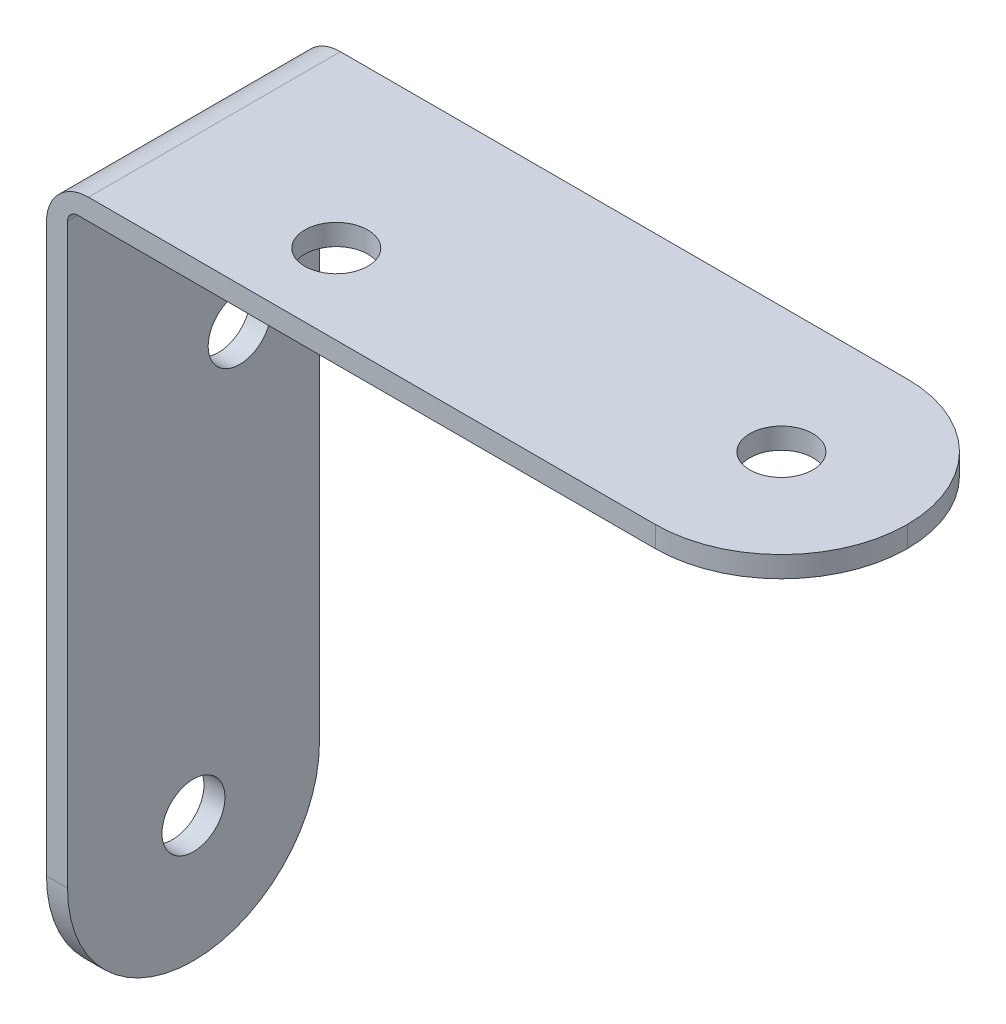
ISO-10303-21;
HEADER;
FILE_DESCRIPTION(('STEP AP214'),'2;1');
FILE_NAME('part.step','',(''),(''),'','','');
FILE_SCHEMA(('AUTOMOTIVE_DESIGN { 1 0 10303 214 1 1 1 1 }'));
ENDSEC;
DATA;
#1=APPLICATION_CONTEXT('core data for automotive mechanical design processes');
#2=APPLICATION_PROTOCOL_DEFINITION('international standard','automotive_design',2000,#1);
#3=PRODUCT_CONTEXT('',#1,'mechanical');
#4=PRODUCT('Part','Part','',(#3));
#5=PRODUCT_RELATED_PRODUCT_CATEGORY('part','',(#4));
#6=PRODUCT_DEFINITION_FORMATION('','',#4);
#7=PRODUCT_DEFINITION_CONTEXT('part definition',#1,'design');
#8=PRODUCT_DEFINITION('design','',#6,#7);
#9=PRODUCT_DEFINITION_SHAPE('','',#8);
#10=(LENGTH_UNIT() NAMED_UNIT(*) SI_UNIT(.MILLI.,.METRE.));
#11=(NAMED_UNIT(*) PLANE_ANGLE_UNIT() SI_UNIT($,.RADIAN.));
#12=(NAMED_UNIT(*) SI_UNIT($,.STERADIAN.) SOLID_ANGLE_UNIT());
#13=UNCERTAINTY_MEASURE_WITH_UNIT(LENGTH_MEASURE(1.E-05),#10,'distance_accuracy_value','');
#14=(GEOMETRIC_REPRESENTATION_CONTEXT(3) GLOBAL_UNCERTAINTY_ASSIGNED_CONTEXT((#13)) GLOBAL_UNIT_ASSIGNED_CONTEXT((#10,
#11,#12)) REPRESENTATION_CONTEXT('',''));
#15=CARTESIAN_POINT('',(0.,0.,0.));
#16=DIRECTION('',(0.,0.,1.));
#17=DIRECTION('',(1.,0.,0.));
#18=AXIS2_PLACEMENT_3D('',#15,#16,#17);
#19=CARTESIAN_POINT('',(0.,-35.,12.));
#20=DIRECTION('',(1.,0.,0.));
#21=DIRECTION('',(0.,0.,-1.));
#22=AXIS2_PLACEMENT_3D('',#19,#20,#21);
#23=PLANE('',#22);
#24=CARTESIAN_POINT('',(0.,-29.,6.));
#25=DIRECTION('',(-1.,0.,0.));
#26=DIRECTION('',(0.,0.,1.));
#27=AXIS2_PLACEMENT_3D('',#24,#25,#26);
#28=CIRCLE('',#27,1.5);
#29=CARTESIAN_POINT('',(0.,-29.,7.5));
#30=VERTEX_POINT('',#29);
#31=EDGE_CURVE('E210',#30,#30,#28,.T.);
#32=ORIENTED_EDGE('',*,*,#31,.F.);
#33=EDGE_LOOP('',(#32));
#34=FACE_BOUND('',#33,.T.);
#35=CARTESIAN_POINT('',(0.,-10.,3.8));
#36=DIRECTION('',(-1.,0.,0.));
#37=DIRECTION('',(0.,0.,1.));
#38=AXIS2_PLACEMENT_3D('',#35,#36,#37);
#39=CIRCLE('',#38,1.5);
#40=CARTESIAN_POINT('',(0.,-10.,5.3));
#41=VERTEX_POINT('',#40);
#42=EDGE_CURVE('E217',#41,#41,#39,.T.);
#43=ORIENTED_EDGE('',*,*,#42,.F.);
#44=EDGE_LOOP('',(#43));
#45=FACE_BOUND('',#44,.T.);
#46=DIRECTION('',(0.,-1.,0.));
#47=VECTOR('',#46,1.);
#48=CARTESIAN_POINT('',(0.,-35.,12.));
#49=LINE('',#48,#47);
#50=CARTESIAN_POINT('',(0.,-2.,12.));
#51=VERTEX_POINT('',#50);
#52=CARTESIAN_POINT('',(0.,-29.,12.));
#53=VERTEX_POINT('',#52);
#54=EDGE_CURVE('E119',#51,#53,#49,.T.);
#55=ORIENTED_EDGE('',*,*,#54,.F.);
#56=DIRECTION('',(0.,0.,-1.));
#57=VECTOR('',#56,1.);
#58=CARTESIAN_POINT('',(0.,-2.,12.));
#59=LINE('',#58,#57);
#60=CARTESIAN_POINT('',(0.,-2.,0.));
#61=VERTEX_POINT('',#60);
#62=EDGE_CURVE('E181',#51,#61,#59,.T.);
#63=ORIENTED_EDGE('',*,*,#62,.T.);
#64=DIRECTION('',(0.,-1.,0.));
#65=VECTOR('',#64,1.);
#66=CARTESIAN_POINT('',(0.,-35.,0.));
#67=LINE('',#66,#65);
#68=CARTESIAN_POINT('',(0.,-29.,0.));
#69=VERTEX_POINT('',#68);
#70=EDGE_CURVE('E185',#61,#69,#67,.T.);
#71=ORIENTED_EDGE('',*,*,#70,.T.);
#72=CARTESIAN_POINT('',(0.,-29.,6.));
#73=DIRECTION('',(1.,0.,0.));
#74=DIRECTION('',(0.,0.,-1.));
#75=AXIS2_PLACEMENT_3D('',#72,#73,#74);
#76=CIRCLE('',#75,6.);
#77=CARTESIAN_POINT('',(0.,-35.,6.));
#78=VERTEX_POINT('',#77);
#79=EDGE_CURVE('E137',#69,#78,#76,.F.);
#80=ORIENTED_EDGE('',*,*,#79,.T.);
#81=CARTESIAN_POINT('',(0.,-29.,6.));
#82=DIRECTION('',(1.,0.,0.));
#83=DIRECTION('',(0.,0.,-1.));
#84=AXIS2_PLACEMENT_3D('',#81,#82,#83);
#85=CIRCLE('',#84,6.);
#86=EDGE_CURVE('E135',#78,#53,#85,.F.);
#87=ORIENTED_EDGE('',*,*,#86,.T.);
#88=EDGE_LOOP('',(#55,#63,#71,#80,#87));
#89=FACE_BOUND('',#88,.T.);
#90=ADVANCED_FACE('F39',(#34,#45,#89),#23,.F.);
#91=CARTESIAN_POINT('',(0.999999999999997,-1.,12.));
#92=DIRECTION('',(-1.,0.,0.));
#93=DIRECTION('',(0.,-1.,0.));
#94=AXIS2_PLACEMENT_3D('',#91,#92,#93);
#95=PLANE('',#94);
#96=CARTESIAN_POINT('',(1.00000000000001,-29.,6.));
#97=DIRECTION('',(-1.,0.,0.));
#98=DIRECTION('',(0.,-1.,0.));
#99=AXIS2_PLACEMENT_3D('',#96,#97,#98);
#100=CIRCLE('',#99,1.5);
#101=CARTESIAN_POINT('',(1.00000000000001,-30.5,6.));
#102=VERTEX_POINT('',#101);
#103=EDGE_CURVE('E43',#102,#102,#100,.T.);
#104=ORIENTED_EDGE('',*,*,#103,.T.);
#105=EDGE_LOOP('',(#104));
#106=FACE_BOUND('',#105,.T.);
#107=CARTESIAN_POINT('',(1.,-10.,3.8));
#108=DIRECTION('',(-1.,0.,0.));
#109=DIRECTION('',(0.,-1.,0.));
#110=AXIS2_PLACEMENT_3D('',#107,#108,#109);
#111=CIRCLE('',#110,1.5);
#112=CARTESIAN_POINT('',(1.,-11.5,3.8));
#113=VERTEX_POINT('',#112);
#114=EDGE_CURVE('E207',#113,#113,#111,.T.);
#115=ORIENTED_EDGE('',*,*,#114,.T.);
#116=EDGE_LOOP('',(#115));
#117=FACE_BOUND('',#116,.T.);
#118=DIRECTION('',(0.,1.,0.));
#119=VECTOR('',#118,1.);
#120=CARTESIAN_POINT('',(0.999999999999997,-1.,0.));
#121=LINE('',#120,#119);
#122=CARTESIAN_POINT('',(1.,-29.,0.));
#123=VERTEX_POINT('',#122);
#124=CARTESIAN_POINT('',(0.999999999999997,-1.5,0.));
#125=VERTEX_POINT('',#124);
#126=EDGE_CURVE('E237',#123,#125,#121,.T.);
#127=ORIENTED_EDGE('',*,*,#126,.T.);
#128=DIRECTION('',(0.,0.,-1.));
#129=VECTOR('',#128,1.);
#130=CARTESIAN_POINT('',(0.999999999999997,-1.5,12.));
#131=LINE('',#130,#129);
#132=CARTESIAN_POINT('',(0.999999999999997,-1.5,12.));
#133=VERTEX_POINT('',#132);
#134=EDGE_CURVE('E63',#125,#133,#131,.F.);
#135=ORIENTED_EDGE('',*,*,#134,.T.);
#136=DIRECTION('',(0.,1.,0.));
#137=VECTOR('',#136,1.);
#138=CARTESIAN_POINT('',(0.999999999999997,-1.,12.));
#139=LINE('',#138,#137);
#140=CARTESIAN_POINT('',(1.,-29.,12.));
#141=VERTEX_POINT('',#140);
#142=EDGE_CURVE('E131',#141,#133,#139,.T.);
#143=ORIENTED_EDGE('',*,*,#142,.F.);
#144=CARTESIAN_POINT('',(1.,-29.,6.));
#145=DIRECTION('',(-1.,0.,0.));
#146=DIRECTION('',(0.,-1.,0.));
#147=AXIS2_PLACEMENT_3D('',#144,#145,#146);
#148=CIRCLE('',#147,6.);
#149=CARTESIAN_POINT('',(1.,-35.,6.));
#150=VERTEX_POINT('',#149);
#151=EDGE_CURVE('E145',#141,#150,#148,.F.);
#152=ORIENTED_EDGE('',*,*,#151,.T.);
#153=CARTESIAN_POINT('',(1.,-29.,6.));
#154=DIRECTION('',(-1.,0.,0.));
#155=DIRECTION('',(0.,-1.,0.));
#156=AXIS2_PLACEMENT_3D('',#153,#154,#155);
#157=CIRCLE('',#156,6.);
#158=EDGE_CURVE('E147',#150,#123,#157,.F.);
#159=ORIENTED_EDGE('',*,*,#158,.T.);
#160=EDGE_LOOP('',(#127,#135,#143,#152,#159));
#161=FACE_BOUND('',#160,.T.);
#162=ADVANCED_FACE('F259',(#106,#117,#161),#95,.F.);
#163=CARTESIAN_POINT('',(35.,-1.,12.));
#164=DIRECTION('',(0.,1.,0.));
#165=DIRECTION('',(0.,0.,1.));
#166=AXIS2_PLACEMENT_3D('',#163,#164,#165);
#167=PLANE('',#166);
#168=CARTESIAN_POINT('',(29.,-1.,6.));
#169=DIRECTION('',(0.,1.,0.));
#170=DIRECTION('',(0.,0.,1.));
#171=AXIS2_PLACEMENT_3D('',#168,#169,#170);
#172=CIRCLE('',#171,1.5);
#173=CARTESIAN_POINT('',(29.,-1.,7.5));
#174=VERTEX_POINT('',#173);
#175=EDGE_CURVE('E223',#174,#174,#172,.T.);
#176=ORIENTED_EDGE('',*,*,#175,.T.);
#177=EDGE_LOOP('',(#176));
#178=FACE_BOUND('',#177,.T.);
#179=CARTESIAN_POINT('',(10.,-1.,8.2));
#180=DIRECTION('',(0.,1.,0.));
#181=DIRECTION('',(0.,0.,1.));
#182=AXIS2_PLACEMENT_3D('',#179,#180,#181);
#183=CIRCLE('',#182,1.5);
#184=CARTESIAN_POINT('',(10.,-1.,9.7));
#185=VERTEX_POINT('',#184);
#186=EDGE_CURVE('E316',#185,#185,#183,.T.);
#187=ORIENTED_EDGE('',*,*,#186,.T.);
#188=EDGE_LOOP('',(#187));
#189=FACE_BOUND('',#188,.T.);
#190=DIRECTION('',(1.,0.,0.));
#191=VECTOR('',#190,1.);
#192=CARTESIAN_POINT('',(35.,-1.,12.));
#193=LINE('',#192,#191);
#194=CARTESIAN_POINT('',(1.49999999999999,-1.,12.));
#195=VERTEX_POINT('',#194);
#196=CARTESIAN_POINT('',(29.,-1.,12.));
#197=VERTEX_POINT('',#196);
#198=EDGE_CURVE('E230',#195,#197,#193,.T.);
#199=ORIENTED_EDGE('',*,*,#198,.F.);
#200=DIRECTION('',(0.,0.,-1.));
#201=VECTOR('',#200,1.);
#202=CARTESIAN_POINT('',(1.49999999999999,-1.,0.));
#203=LINE('',#202,#201);
#204=CARTESIAN_POINT('',(1.49999999999999,-1.,0.));
#205=VERTEX_POINT('',#204);
#206=EDGE_CURVE('E200',#195,#205,#203,.T.);
#207=ORIENTED_EDGE('',*,*,#206,.T.);
#208=DIRECTION('',(1.,0.,0.));
#209=VECTOR('',#208,1.);
#210=CARTESIAN_POINT('',(35.,-1.,0.));
#211=LINE('',#210,#209);
#212=CARTESIAN_POINT('',(29.,-1.,0.));
#213=VERTEX_POINT('',#212);
#214=EDGE_CURVE('E240',#205,#213,#211,.T.);
#215=ORIENTED_EDGE('',*,*,#214,.T.);
#216=CARTESIAN_POINT('',(29.,-1.,6.));
#217=DIRECTION('',(0.,1.,0.));
#218=DIRECTION('',(0.,0.,1.));
#219=AXIS2_PLACEMENT_3D('',#216,#217,#218);
#220=CIRCLE('',#219,6.);
#221=CARTESIAN_POINT('',(35.,-1.,6.));
#222=VERTEX_POINT('',#221);
#223=EDGE_CURVE('E178',#213,#222,#220,.F.);
#224=ORIENTED_EDGE('',*,*,#223,.T.);
#225=CARTESIAN_POINT('',(29.,-1.,6.));
#226=DIRECTION('',(0.,1.,0.));
#227=DIRECTION('',(0.,0.,1.));
#228=AXIS2_PLACEMENT_3D('',#225,#226,#227);
#229=CIRCLE('',#228,6.);
#230=EDGE_CURVE('E174',#222,#197,#229,.F.);
#231=ORIENTED_EDGE('',*,*,#230,.T.);
#232=EDGE_LOOP('',(#199,#207,#215,#224,#231));
#233=FACE_BOUND('',#232,.T.);
#234=ADVANCED_FACE('F265',(#178,#189,#233),#167,.F.);
#235=CARTESIAN_POINT('',(0.,0.,12.));
#236=DIRECTION('',(0.,-1.,0.));
#237=DIRECTION('',(0.,0.,-1.));
#238=AXIS2_PLACEMENT_3D('',#235,#236,#237);
#239=PLANE('',#238);
#240=CARTESIAN_POINT('',(29.,0.,6.));
#241=DIRECTION('',(0.,1.,0.));
#242=DIRECTION('',(0.,0.,1.));
#243=AXIS2_PLACEMENT_3D('',#240,#241,#242);
#244=CIRCLE('',#243,1.5);
#245=CARTESIAN_POINT('',(29.,0.,7.5));
#246=VERTEX_POINT('',#245);
#247=EDGE_CURVE('E319',#246,#246,#244,.T.);
#248=ORIENTED_EDGE('',*,*,#247,.F.);
#249=EDGE_LOOP('',(#248));
#250=FACE_BOUND('',#249,.T.);
#251=CARTESIAN_POINT('',(10.,0.,8.2));
#252=DIRECTION('',(0.,1.,0.));
#253=DIRECTION('',(0.,0.,1.));
#254=AXIS2_PLACEMENT_3D('',#251,#252,#253);
#255=CIRCLE('',#254,1.5);
#256=CARTESIAN_POINT('',(10.,0.,9.7));
#257=VERTEX_POINT('',#256);
#258=EDGE_CURVE('E323',#257,#257,#255,.T.);
#259=ORIENTED_EDGE('',*,*,#258,.F.);
#260=EDGE_LOOP('',(#259));
#261=FACE_BOUND('',#260,.T.);
#262=DIRECTION('',(-1.,0.,0.));
#263=VECTOR('',#262,1.);
#264=CARTESIAN_POINT('',(0.,0.,0.));
#265=LINE('',#264,#263);
#266=CARTESIAN_POINT('',(29.,0.,0.));
#267=VERTEX_POINT('',#266);
#268=CARTESIAN_POINT('',(2.,0.,0.));
#269=VERTEX_POINT('',#268);
#270=EDGE_CURVE('E132',#267,#269,#265,.T.);
#271=ORIENTED_EDGE('',*,*,#270,.T.);
#272=DIRECTION('',(0.,0.,-1.));
#273=VECTOR('',#272,1.);
#274=CARTESIAN_POINT('',(2.,0.,12.));
#275=LINE('',#274,#273);
#276=CARTESIAN_POINT('',(2.,0.,12.));
#277=VERTEX_POINT('',#276);
#278=EDGE_CURVE('E195',#269,#277,#275,.F.);
#279=ORIENTED_EDGE('',*,*,#278,.T.);
#280=DIRECTION('',(-1.,0.,0.));
#281=VECTOR('',#280,1.);
#282=CARTESIAN_POINT('',(0.,0.,12.));
#283=LINE('',#282,#281);
#284=CARTESIAN_POINT('',(29.,0.,12.));
#285=VERTEX_POINT('',#284);
#286=EDGE_CURVE('E153',#285,#277,#283,.T.);
#287=ORIENTED_EDGE('',*,*,#286,.F.);
#288=CARTESIAN_POINT('',(29.,0.,6.));
#289=DIRECTION('',(0.,-1.,0.));
#290=DIRECTION('',(0.,0.,-1.));
#291=AXIS2_PLACEMENT_3D('',#288,#289,#290);
#292=CIRCLE('',#291,6.);
#293=CARTESIAN_POINT('',(35.,0.,6.));
#294=VERTEX_POINT('',#293);
#295=EDGE_CURVE('E168',#285,#294,#292,.F.);
#296=ORIENTED_EDGE('',*,*,#295,.T.);
#297=CARTESIAN_POINT('',(29.,0.,6.));
#298=DIRECTION('',(0.,-1.,0.));
#299=DIRECTION('',(0.,0.,-1.));
#300=AXIS2_PLACEMENT_3D('',#297,#298,#299);
#301=CIRCLE('',#300,6.);
#302=EDGE_CURVE('E171',#294,#267,#301,.F.);
#303=ORIENTED_EDGE('',*,*,#302,.T.);
#304=EDGE_LOOP('',(#271,#279,#287,#296,#303));
#305=FACE_BOUND('',#304,.T.);
#306=ADVANCED_FACE('F247',(#250,#261,#305),#239,.F.);
#307=CARTESIAN_POINT('',(0.,0.,12.));
#308=DIRECTION('',(0.,0.,-1.));
#309=DIRECTION('',(-1.,0.,0.));
#310=AXIS2_PLACEMENT_3D('',#307,#308,#309);
#311=PLANE('',#310);
#312=ORIENTED_EDGE('',*,*,#286,.T.);
#313=CARTESIAN_POINT('',(2.,-2.,12.));
#314=DIRECTION('',(0.,0.,-1.));
#315=DIRECTION('',(-1.,0.,0.));
#316=AXIS2_PLACEMENT_3D('',#313,#314,#315);
#317=CIRCLE('',#316,2.);
#318=EDGE_CURVE('E126',#277,#51,#317,.F.);
#319=ORIENTED_EDGE('',*,*,#318,.T.);
#320=ORIENTED_EDGE('',*,*,#54,.T.);
#321=DIRECTION('',(1.,0.,0.));
#322=VECTOR('',#321,1.);
#323=CARTESIAN_POINT('',(0.,-29.,12.));
#324=LINE('',#323,#322);
#325=EDGE_CURVE('E124',#53,#141,#324,.T.);
#326=ORIENTED_EDGE('',*,*,#325,.T.);
#327=ORIENTED_EDGE('',*,*,#142,.T.);
#328=CARTESIAN_POINT('',(1.49999999999999,-1.5,12.));
#329=DIRECTION('',(0.,0.,-1.));
#330=DIRECTION('',(-1.,0.,0.));
#331=AXIS2_PLACEMENT_3D('',#328,#329,#330);
#332=CIRCLE('',#331,0.5);
#333=EDGE_CURVE('E11',#133,#195,#332,.T.);
#334=ORIENTED_EDGE('',*,*,#333,.T.);
#335=ORIENTED_EDGE('',*,*,#198,.T.);
#336=DIRECTION('',(0.,1.,0.));
#337=VECTOR('',#336,1.);
#338=CARTESIAN_POINT('',(29.,0.,12.));
#339=LINE('',#338,#337);
#340=EDGE_CURVE('E148',#197,#285,#339,.T.);
#341=ORIENTED_EDGE('',*,*,#340,.T.);
#342=EDGE_LOOP('',(#312,#319,#320,#326,#327,#334,#335,#341));
#343=FACE_BOUND('',#342,.T.);
#344=ADVANCED_FACE('F122',(#343),#311,.F.);
#345=CARTESIAN_POINT('',(0.,0.,0.));
#346=DIRECTION('',(0.,0.,-1.));
#347=DIRECTION('',(-1.,0.,0.));
#348=AXIS2_PLACEMENT_3D('',#345,#346,#347);
#349=PLANE('',#348);
#350=ORIENTED_EDGE('',*,*,#70,.F.);
#351=CARTESIAN_POINT('',(2.,-2.,0.));
#352=DIRECTION('',(0.,0.,-1.));
#353=DIRECTION('',(-1.,0.,0.));
#354=AXIS2_PLACEMENT_3D('',#351,#352,#353);
#355=CIRCLE('',#354,2.);
#356=EDGE_CURVE('E192',#61,#269,#355,.T.);
#357=ORIENTED_EDGE('',*,*,#356,.T.);
#358=ORIENTED_EDGE('',*,*,#270,.F.);
#359=DIRECTION('',(0.,1.,0.));
#360=VECTOR('',#359,1.);
#361=CARTESIAN_POINT('',(29.,-1.,0.));
#362=LINE('',#361,#360);
#363=EDGE_CURVE('E142',#267,#213,#362,.F.);
#364=ORIENTED_EDGE('',*,*,#363,.T.);
#365=ORIENTED_EDGE('',*,*,#214,.F.);
#366=CARTESIAN_POINT('',(1.49999999999999,-1.5,0.));
#367=DIRECTION('',(0.,0.,-1.));
#368=DIRECTION('',(-1.,0.,0.));
#369=AXIS2_PLACEMENT_3D('',#366,#367,#368);
#370=CIRCLE('',#369,0.5);
#371=EDGE_CURVE('E49',#205,#125,#370,.F.);
#372=ORIENTED_EDGE('',*,*,#371,.T.);
#373=ORIENTED_EDGE('',*,*,#126,.F.);
#374=DIRECTION('',(1.,0.,0.));
#375=VECTOR('',#374,1.);
#376=CARTESIAN_POINT('',(0.,-29.,0.));
#377=LINE('',#376,#375);
#378=EDGE_CURVE('E164',#123,#69,#377,.F.);
#379=ORIENTED_EDGE('',*,*,#378,.T.);
#380=EDGE_LOOP('',(#350,#357,#358,#364,#365,#372,#373,#379));
#381=FACE_BOUND('',#380,.T.);
#382=ADVANCED_FACE('F254',(#381),#349,.T.);
#383=CARTESIAN_POINT('',(1.,-29.,6.));
#384=DIRECTION('',(-1.,0.,0.));
#385=DIRECTION('',(0.,0.,1.));
#386=AXIS2_PLACEMENT_3D('',#383,#384,#385);
#387=CYLINDRICAL_SURFACE('',#386,6.);
#388=DIRECTION('',(1.,0.,0.));
#389=VECTOR('',#388,1.);
#390=CARTESIAN_POINT('',(1.,-35.,6.));
#391=LINE('',#390,#389);
#392=EDGE_CURVE('E182',#78,#150,#391,.T.);
#393=ORIENTED_EDGE('',*,*,#392,.F.);
#394=ORIENTED_EDGE('',*,*,#79,.F.);
#395=ORIENTED_EDGE('',*,*,#378,.F.);
#396=ORIENTED_EDGE('',*,*,#158,.F.);
#397=EDGE_LOOP('',(#393,#394,#395,#396));
#398=FACE_BOUND('',#397,.T.);
#399=ADVANCED_FACE('F258',(#398),#387,.T.);
#400=CARTESIAN_POINT('',(0.,-29.,6.));
#401=DIRECTION('',(1.,0.,0.));
#402=DIRECTION('',(0.,0.,-1.));
#403=AXIS2_PLACEMENT_3D('',#400,#401,#402);
#404=CYLINDRICAL_SURFACE('',#403,6.);
#405=ORIENTED_EDGE('',*,*,#86,.F.);
#406=ORIENTED_EDGE('',*,*,#392,.T.);
#407=ORIENTED_EDGE('',*,*,#151,.F.);
#408=ORIENTED_EDGE('',*,*,#325,.F.);
#409=EDGE_LOOP('',(#405,#406,#407,#408));
#410=FACE_BOUND('',#409,.T.);
#411=ADVANCED_FACE('F144',(#410),#404,.T.);
#412=CARTESIAN_POINT('',(29.,0.,6.));
#413=DIRECTION('',(0.,1.,0.));
#414=DIRECTION('',(0.,0.,1.));
#415=AXIS2_PLACEMENT_3D('',#412,#413,#414);
#416=CYLINDRICAL_SURFACE('',#415,6.);
#417=ORIENTED_EDGE('',*,*,#340,.F.);
#418=ORIENTED_EDGE('',*,*,#230,.F.);
#419=DIRECTION('',(0.,1.,0.));
#420=VECTOR('',#419,1.);
#421=CARTESIAN_POINT('',(35.,0.,6.));
#422=LINE('',#421,#420);
#423=EDGE_CURVE('E186',#294,#222,#422,.F.);
#424=ORIENTED_EDGE('',*,*,#423,.F.);
#425=ORIENTED_EDGE('',*,*,#295,.F.);
#426=EDGE_LOOP('',(#417,#418,#424,#425));
#427=FACE_BOUND('',#426,.T.);
#428=ADVANCED_FACE('F273',(#427),#416,.T.);
#429=CARTESIAN_POINT('',(29.,0.,6.));
#430=DIRECTION('',(0.,-1.,0.));
#431=DIRECTION('',(0.,0.,-1.));
#432=AXIS2_PLACEMENT_3D('',#429,#430,#431);
#433=CYLINDRICAL_SURFACE('',#432,6.);
#434=ORIENTED_EDGE('',*,*,#223,.F.);
#435=ORIENTED_EDGE('',*,*,#363,.F.);
#436=ORIENTED_EDGE('',*,*,#302,.F.);
#437=ORIENTED_EDGE('',*,*,#423,.T.);
#438=EDGE_LOOP('',(#434,#435,#436,#437));
#439=FACE_BOUND('',#438,.T.);
#440=ADVANCED_FACE('F268',(#439),#433,.T.);
#441=CARTESIAN_POINT('',(2.,-2.,12.));
#442=DIRECTION('',(0.,0.,-1.));
#443=DIRECTION('',(-1.,0.,0.));
#444=AXIS2_PLACEMENT_3D('',#441,#442,#443);
#445=CYLINDRICAL_SURFACE('',#444,2.);
#446=ORIENTED_EDGE('',*,*,#318,.F.);
#447=ORIENTED_EDGE('',*,*,#278,.F.);
#448=ORIENTED_EDGE('',*,*,#356,.F.);
#449=ORIENTED_EDGE('',*,*,#62,.F.);
#450=EDGE_LOOP('',(#446,#447,#448,#449));
#451=FACE_BOUND('',#450,.T.);
#452=ADVANCED_FACE('F252',(#451),#445,.T.);
#453=CARTESIAN_POINT('',(1.49999999999999,-1.5,12.));
#454=DIRECTION('',(0.,0.,1.));
#455=DIRECTION('',(1.,0.,0.));
#456=AXIS2_PLACEMENT_3D('',#453,#454,#455);
#457=CYLINDRICAL_SURFACE('',#456,0.5);
#458=ORIENTED_EDGE('',*,*,#333,.F.);
#459=ORIENTED_EDGE('',*,*,#134,.F.);
#460=ORIENTED_EDGE('',*,*,#371,.F.);
#461=ORIENTED_EDGE('',*,*,#206,.F.);
#462=EDGE_LOOP('',(#458,#459,#460,#461));
#463=FACE_BOUND('',#462,.T.);
#464=ADVANCED_FACE('F41',(#463),#457,.F.);
#465=CARTESIAN_POINT('',(35.,-10.,3.8));
#466=DIRECTION('',(-1.,0.,0.));
#467=DIRECTION('',(0.,0.,1.));
#468=AXIS2_PLACEMENT_3D('',#465,#466,#467);
#469=CYLINDRICAL_SURFACE('',#468,1.5);
#470=ORIENTED_EDGE('',*,*,#42,.T.);
#471=EDGE_LOOP('',(#470));
#472=FACE_BOUND('',#471,.T.);
#473=ORIENTED_EDGE('',*,*,#114,.F.);
#474=EDGE_LOOP('',(#473));
#475=FACE_BOUND('',#474,.T.);
#476=ADVANCED_FACE('F342',(#472,#475),#469,.F.);
#477=CARTESIAN_POINT('',(35.,-29.,6.));
#478=DIRECTION('',(-1.,0.,0.));
#479=DIRECTION('',(0.,0.,1.));
#480=AXIS2_PLACEMENT_3D('',#477,#478,#479);
#481=CYLINDRICAL_SURFACE('',#480,1.5);
#482=ORIENTED_EDGE('',*,*,#31,.T.);
#483=EDGE_LOOP('',(#482));
#484=FACE_BOUND('',#483,.T.);
#485=ORIENTED_EDGE('',*,*,#103,.F.);
#486=EDGE_LOOP('',(#485));
#487=FACE_BOUND('',#486,.T.);
#488=ADVANCED_FACE('F334',(#484,#487),#481,.F.);
#489=CARTESIAN_POINT('',(10.,-35.,8.2));
#490=DIRECTION('',(0.,1.,0.));
#491=DIRECTION('',(0.,0.,1.));
#492=AXIS2_PLACEMENT_3D('',#489,#490,#491);
#493=CYLINDRICAL_SURFACE('',#492,1.5);
#494=ORIENTED_EDGE('',*,*,#258,.T.);
#495=EDGE_LOOP('',(#494));
#496=FACE_BOUND('',#495,.T.);
#497=ORIENTED_EDGE('',*,*,#186,.F.);
#498=EDGE_LOOP('',(#497));
#499=FACE_BOUND('',#498,.T.);
#500=ADVANCED_FACE('F330',(#496,#499),#493,.F.);
#501=CARTESIAN_POINT('',(29.,-35.,6.));
#502=DIRECTION('',(0.,1.,0.));
#503=DIRECTION('',(0.,0.,1.));
#504=AXIS2_PLACEMENT_3D('',#501,#502,#503);
#505=CYLINDRICAL_SURFACE('',#504,1.5);
#506=ORIENTED_EDGE('',*,*,#247,.T.);
#507=EDGE_LOOP('',(#506));
#508=FACE_BOUND('',#507,.T.);
#509=ORIENTED_EDGE('',*,*,#175,.F.);
#510=EDGE_LOOP('',(#509));
#511=FACE_BOUND('',#510,.T.);
#512=ADVANCED_FACE('F333',(#508,#511),#505,.F.);
#513=CLOSED_SHELL('',(#90,#162,#234,#306,#344,#382,#399,#411,#428,#440,#452,#464,#476,#488,#500,#512));
#514=MANIFOLD_SOLID_BREP('B2',#513);
#515=ADVANCED_BREP_SHAPE_REPRESENTATION('',(#18,#514),#14);
#516=SHAPE_DEFINITION_REPRESENTATION(#9,#515);
ENDSEC;
END-ISO-10303-21;
